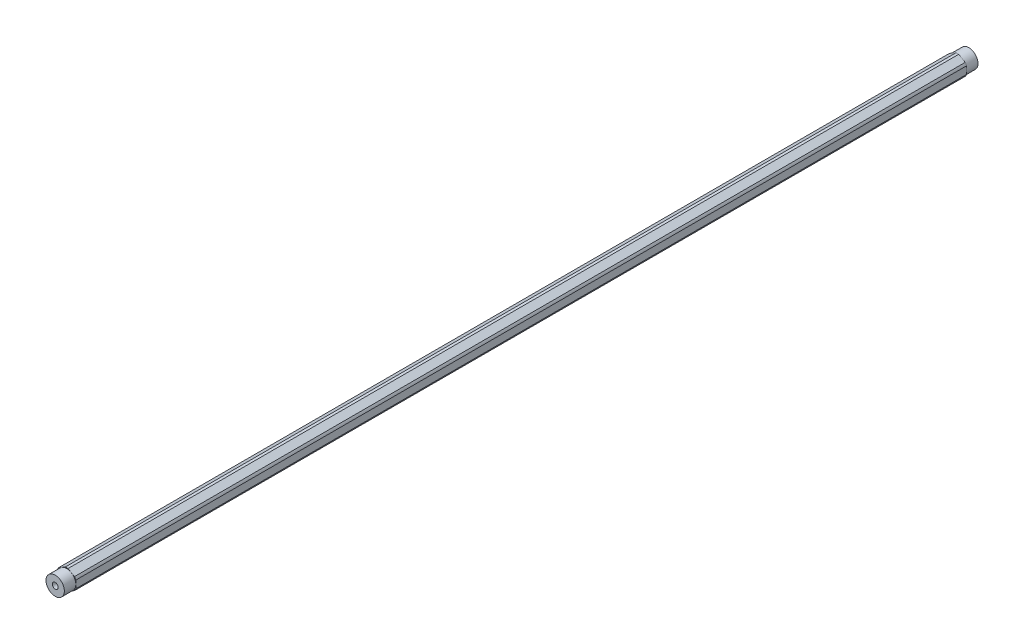
ISO-10303-21;
HEADER;
FILE_DESCRIPTION(('STEP AP214'),'2;1');
FILE_NAME('part.step','',(''),(''),'','','');
FILE_SCHEMA(('AUTOMOTIVE_DESIGN { 1 0 10303 214 1 1 1 1 }'));
ENDSEC;
DATA;
#1=APPLICATION_CONTEXT('core data for automotive mechanical design processes');
#2=APPLICATION_PROTOCOL_DEFINITION('international standard','automotive_design',2000,#1);
#3=PRODUCT_CONTEXT('',#1,'mechanical');
#4=PRODUCT('Part','Part','',(#3));
#5=PRODUCT_RELATED_PRODUCT_CATEGORY('part','',(#4));
#6=PRODUCT_DEFINITION_FORMATION('','',#4);
#7=PRODUCT_DEFINITION_CONTEXT('part definition',#1,'design');
#8=PRODUCT_DEFINITION('design','',#6,#7);
#9=PRODUCT_DEFINITION_SHAPE('','',#8);
#10=(LENGTH_UNIT() NAMED_UNIT(*) SI_UNIT(.MILLI.,.METRE.));
#11=(NAMED_UNIT(*) PLANE_ANGLE_UNIT() SI_UNIT($,.RADIAN.));
#12=(NAMED_UNIT(*) SI_UNIT($,.STERADIAN.) SOLID_ANGLE_UNIT());
#13=UNCERTAINTY_MEASURE_WITH_UNIT(LENGTH_MEASURE(1.E-05),#10,'distance_accuracy_value','');
#14=(GEOMETRIC_REPRESENTATION_CONTEXT(3) GLOBAL_UNCERTAINTY_ASSIGNED_CONTEXT((#13)) GLOBAL_UNIT_ASSIGNED_CONTEXT((#10,
#11,#12)) REPRESENTATION_CONTEXT('',''));
#15=CARTESIAN_POINT('',(0.,0.,0.));
#16=DIRECTION('',(0.,0.,1.));
#17=DIRECTION('',(1.,0.,0.));
#18=AXIS2_PLACEMENT_3D('',#15,#16,#17);
#19=CARTESIAN_POINT('',(0.,0.,307.975));
#20=DIRECTION('',(0.,0.,-1.));
#21=DIRECTION('',(-1.,0.,0.));
#22=AXIS2_PLACEMENT_3D('',#19,#20,#21);
#23=CYLINDRICAL_SURFACE('',#22,2.0193);
#24=CARTESIAN_POINT('',(0.,0.,-315.9125));
#25=DIRECTION('',(0.,0.,-1.));
#26=DIRECTION('',(-1.,0.,0.));
#27=AXIS2_PLACEMENT_3D('',#24,#25,#26);
#28=CIRCLE('',#27,2.01929999999999);
#29=CARTESIAN_POINT('',(-2.01929999999999,0.,-315.9125));
#30=VERTEX_POINT('',#29);
#31=EDGE_CURVE('E192',#30,#30,#28,.T.);
#32=ORIENTED_EDGE('',*,*,#31,.T.);
#33=EDGE_LOOP('',(#32));
#34=FACE_BOUND('',#33,.T.);
#35=CARTESIAN_POINT('',(0.,0.,315.9125));
#36=DIRECTION('',(0.,0.,1.));
#37=DIRECTION('',(1.,0.,0.));
#38=AXIS2_PLACEMENT_3D('',#35,#36,#37);
#39=CIRCLE('',#38,2.01929999999999);
#40=CARTESIAN_POINT('',(2.01929999999999,0.,315.9125));
#41=VERTEX_POINT('',#40);
#42=EDGE_CURVE('E396',#41,#41,#39,.T.);
#43=ORIENTED_EDGE('',*,*,#42,.T.);
#44=EDGE_LOOP('',(#43));
#45=FACE_BOUND('',#44,.T.);
#46=ADVANCED_FACE('F53',(#34,#45),#23,.F.);
#47=CARTESIAN_POINT('',(0.,0.,-307.975));
#48=DIRECTION('',(0.,0.,1.));
#49=DIRECTION('',(1.,0.,0.));
#50=AXIS2_PLACEMENT_3D('',#47,#48,#49);
#51=PLANE('',#50);
#52=DIRECTION('',(0.,1.,0.));
#53=VECTOR('',#52,1.);
#54=CARTESIAN_POINT('',(6.35,0.,-307.975));
#55=LINE('',#54,#53);
#56=CARTESIAN_POINT('',(6.35,0.,-307.975));
#57=VERTEX_POINT('',#56);
#58=CARTESIAN_POINT('',(6.35,2.59030191290514,-307.975));
#59=VERTEX_POINT('',#58);
#60=EDGE_CURVE('E189',#57,#59,#55,.T.);
#61=ORIENTED_EDGE('',*,*,#60,.F.);
#62=CARTESIAN_POINT('',(0.,0.,-307.975));
#63=DIRECTION('',(0.,0.,1.));
#64=DIRECTION('',(1.,0.,0.));
#65=AXIS2_PLACEMENT_3D('',#62,#63,#64);
#66=CIRCLE('',#65,6.35);
#67=CARTESIAN_POINT('',(3.175,5.49926131403119,-307.975));
#68=VERTEX_POINT('',#67);
#69=EDGE_CURVE('E63',#57,#68,#66,.T.);
#70=ORIENTED_EDGE('',*,*,#69,.T.);
#71=DIRECTION('',(-0.866025403784439,0.5,0.));
#72=VECTOR('',#71,1.);
#73=CARTESIAN_POINT('',(3.175,5.49926131403119,-307.975));
#74=LINE('',#73,#72);
#75=CARTESIAN_POINT('',(5.41826726004727,4.20411035757862,-307.975));
#76=VERTEX_POINT('',#75);
#77=EDGE_CURVE('E188',#76,#68,#74,.T.);
#78=ORIENTED_EDGE('',*,*,#77,.F.);
#79=CARTESIAN_POINT('',(0.,0.,-307.975));
#80=DIRECTION('',(0.,0.,1.));
#81=DIRECTION('',(1.,0.,0.));
#82=AXIS2_PLACEMENT_3D('',#79,#80,#81);
#83=CIRCLE('',#82,6.858);
#84=EDGE_CURVE('E201',#59,#76,#83,.T.);
#85=ORIENTED_EDGE('',*,*,#84,.F.);
#86=EDGE_LOOP('',(#61,#70,#78,#85));
#87=FACE_BOUND('',#86,.T.);
#88=ADVANCED_FACE('F185',(#87),#51,.F.);
#89=CARTESIAN_POINT('',(0.931732739952731,6.79441227048375,-307.975));
#90=VERTEX_POINT('',#89);
#91=EDGE_CURVE('E195',#68,#90,#74,.T.);
#92=ORIENTED_EDGE('',*,*,#91,.F.);
#93=CARTESIAN_POINT('',(-3.175,5.49926131403119,-307.975));
#94=VERTEX_POINT('',#93);
#95=EDGE_CURVE('E11',#68,#94,#66,.T.);
#96=ORIENTED_EDGE('',*,*,#95,.T.);
#97=DIRECTION('',(-0.866025403784439,-0.5,0.));
#98=VECTOR('',#97,1.);
#99=CARTESIAN_POINT('',(-3.175,5.49926131403119,-307.975));
#100=LINE('',#99,#98);
#101=CARTESIAN_POINT('',(-0.93173273995273,6.79441227048375,-307.975));
#102=VERTEX_POINT('',#101);
#103=EDGE_CURVE('E213',#102,#94,#100,.T.);
#104=ORIENTED_EDGE('',*,*,#103,.F.);
#105=EDGE_CURVE('E197',#90,#102,#83,.T.);
#106=ORIENTED_EDGE('',*,*,#105,.F.);
#107=EDGE_LOOP('',(#92,#96,#104,#106));
#108=FACE_BOUND('',#107,.T.);
#109=ADVANCED_FACE('F196',(#108),#51,.F.);
#110=CARTESIAN_POINT('',(-5.41826726004727,4.20411035757862,-307.975));
#111=VERTEX_POINT('',#110);
#112=EDGE_CURVE('E208',#94,#111,#100,.T.);
#113=ORIENTED_EDGE('',*,*,#112,.F.);
#114=CARTESIAN_POINT('',(-6.35,0.,-307.975));
#115=VERTEX_POINT('',#114);
#116=EDGE_CURVE('E61',#94,#115,#66,.T.);
#117=ORIENTED_EDGE('',*,*,#116,.T.);
#118=DIRECTION('',(0.,-1.,0.));
#119=VECTOR('',#118,1.);
#120=CARTESIAN_POINT('',(-6.35,0.,-307.975));
#121=LINE('',#120,#119);
#122=CARTESIAN_POINT('',(-6.35,2.59030191290514,-307.975));
#123=VERTEX_POINT('',#122);
#124=EDGE_CURVE('E216',#123,#115,#121,.T.);
#125=ORIENTED_EDGE('',*,*,#124,.F.);
#126=EDGE_CURVE('E210',#111,#123,#83,.T.);
#127=ORIENTED_EDGE('',*,*,#126,.F.);
#128=EDGE_LOOP('',(#113,#117,#125,#127));
#129=FACE_BOUND('',#128,.T.);
#130=ADVANCED_FACE('F472',(#129),#51,.F.);
#131=CARTESIAN_POINT('',(-6.35,-2.59030191290514,-307.975));
#132=VERTEX_POINT('',#131);
#133=EDGE_CURVE('E220',#115,#132,#121,.T.);
#134=ORIENTED_EDGE('',*,*,#133,.F.);
#135=CARTESIAN_POINT('',(-3.175,-5.49926131403119,-307.975));
#136=VERTEX_POINT('',#135);
#137=EDGE_CURVE('E353',#115,#136,#66,.T.);
#138=ORIENTED_EDGE('',*,*,#137,.T.);
#139=DIRECTION('',(0.866025403784439,-0.5,0.));
#140=VECTOR('',#139,1.);
#141=CARTESIAN_POINT('',(-3.175,-5.49926131403119,-307.975));
#142=LINE('',#141,#140);
#143=CARTESIAN_POINT('',(-5.41826726004727,-4.20411035757862,-307.975));
#144=VERTEX_POINT('',#143);
#145=EDGE_CURVE('E221',#144,#136,#142,.T.);
#146=ORIENTED_EDGE('',*,*,#145,.F.);
#147=EDGE_CURVE('E219',#132,#144,#83,.T.);
#148=ORIENTED_EDGE('',*,*,#147,.F.);
#149=EDGE_LOOP('',(#134,#138,#146,#148));
#150=FACE_BOUND('',#149,.T.);
#151=ADVANCED_FACE('F352',(#150),#51,.F.);
#152=CARTESIAN_POINT('',(-0.931732739952726,-6.79441227048375,-307.975));
#153=VERTEX_POINT('',#152);
#154=EDGE_CURVE('E225',#136,#153,#142,.T.);
#155=ORIENTED_EDGE('',*,*,#154,.F.);
#156=CARTESIAN_POINT('',(3.175,-5.49926131403119,-307.975));
#157=VERTEX_POINT('',#156);
#158=EDGE_CURVE('E282',#136,#157,#66,.T.);
#159=ORIENTED_EDGE('',*,*,#158,.T.);
#160=DIRECTION('',(0.866025403784439,0.5,0.));
#161=VECTOR('',#160,1.);
#162=CARTESIAN_POINT('',(3.175,-5.49926131403118,-307.975));
#163=LINE('',#162,#161);
#164=CARTESIAN_POINT('',(0.931732739952718,-6.79441227048375,-307.975));
#165=VERTEX_POINT('',#164);
#166=EDGE_CURVE('E226',#165,#157,#163,.T.);
#167=ORIENTED_EDGE('',*,*,#166,.F.);
#168=EDGE_CURVE('E224',#153,#165,#83,.T.);
#169=ORIENTED_EDGE('',*,*,#168,.F.);
#170=EDGE_LOOP('',(#155,#159,#167,#169));
#171=FACE_BOUND('',#170,.T.);
#172=ADVANCED_FACE('F373',(#171),#51,.F.);
#173=CARTESIAN_POINT('',(0.,0.,307.975));
#174=DIRECTION('',(0.,0.,1.));
#175=DIRECTION('',(1.,0.,0.));
#176=AXIS2_PLACEMENT_3D('',#173,#174,#175);
#177=PLANE('',#176);
#178=CARTESIAN_POINT('',(0.,0.,307.975));
#179=DIRECTION('',(0.,0.,1.));
#180=DIRECTION('',(1.,0.,0.));
#181=AXIS2_PLACEMENT_3D('',#178,#179,#180);
#182=CIRCLE('',#181,6.35);
#183=CARTESIAN_POINT('',(6.35,0.,307.975));
#184=VERTEX_POINT('',#183);
#185=CARTESIAN_POINT('',(3.175,5.49926131403119,307.975));
#186=VERTEX_POINT('',#185);
#187=EDGE_CURVE('E266',#184,#186,#182,.T.);
#188=ORIENTED_EDGE('',*,*,#187,.F.);
#189=DIRECTION('',(0.,1.,0.));
#190=VECTOR('',#189,1.);
#191=CARTESIAN_POINT('',(6.35,0.,307.975));
#192=LINE('',#191,#190);
#193=CARTESIAN_POINT('',(6.35,2.59030191290514,307.975));
#194=VERTEX_POINT('',#193);
#195=EDGE_CURVE('E333',#184,#194,#192,.T.);
#196=ORIENTED_EDGE('',*,*,#195,.T.);
#197=CARTESIAN_POINT('',(0.,0.,307.975));
#198=DIRECTION('',(0.,0.,1.));
#199=DIRECTION('',(1.,0.,0.));
#200=AXIS2_PLACEMENT_3D('',#197,#198,#199);
#201=CIRCLE('',#200,6.858);
#202=CARTESIAN_POINT('',(5.41826726004727,4.20411035757862,307.975));
#203=VERTEX_POINT('',#202);
#204=EDGE_CURVE('E324',#194,#203,#201,.T.);
#205=ORIENTED_EDGE('',*,*,#204,.T.);
#206=DIRECTION('',(-0.866025403784439,0.5,0.));
#207=VECTOR('',#206,1.);
#208=CARTESIAN_POINT('',(3.175,5.49926131403119,307.975));
#209=LINE('',#208,#207);
#210=EDGE_CURVE('E327',#203,#186,#209,.T.);
#211=ORIENTED_EDGE('',*,*,#210,.T.);
#212=EDGE_LOOP('',(#188,#196,#205,#211));
#213=FACE_BOUND('',#212,.T.);
#214=ADVANCED_FACE('F370',(#213),#177,.T.);
#215=CARTESIAN_POINT('',(-3.175,5.49926131403119,307.975));
#216=VERTEX_POINT('',#215);
#217=EDGE_CURVE('E274',#186,#216,#182,.T.);
#218=ORIENTED_EDGE('',*,*,#217,.F.);
#219=CARTESIAN_POINT('',(0.931732739952731,6.79441227048375,307.975));
#220=VERTEX_POINT('',#219);
#221=EDGE_CURVE('E328',#186,#220,#209,.T.);
#222=ORIENTED_EDGE('',*,*,#221,.T.);
#223=CARTESIAN_POINT('',(-0.93173273995273,6.79441227048375,307.975));
#224=VERTEX_POINT('',#223);
#225=EDGE_CURVE('E330',#220,#224,#201,.T.);
#226=ORIENTED_EDGE('',*,*,#225,.T.);
#227=DIRECTION('',(-0.866025403784439,-0.5,0.));
#228=VECTOR('',#227,1.);
#229=CARTESIAN_POINT('',(-3.175,5.49926131403119,307.975));
#230=LINE('',#229,#228);
#231=EDGE_CURVE('E312',#224,#216,#230,.T.);
#232=ORIENTED_EDGE('',*,*,#231,.T.);
#233=EDGE_LOOP('',(#218,#222,#226,#232));
#234=FACE_BOUND('',#233,.T.);
#235=ADVANCED_FACE('F372',(#234),#177,.T.);
#236=CARTESIAN_POINT('',(-6.35,0.,307.975));
#237=VERTEX_POINT('',#236);
#238=EDGE_CURVE('E280',#216,#237,#182,.T.);
#239=ORIENTED_EDGE('',*,*,#238,.F.);
#240=CARTESIAN_POINT('',(-5.41826726004727,4.20411035757862,307.975));
#241=VERTEX_POINT('',#240);
#242=EDGE_CURVE('E331',#216,#241,#230,.T.);
#243=ORIENTED_EDGE('',*,*,#242,.T.);
#244=CARTESIAN_POINT('',(-6.35,2.59030191290514,307.975));
#245=VERTEX_POINT('',#244);
#246=EDGE_CURVE('E299',#241,#245,#201,.T.);
#247=ORIENTED_EDGE('',*,*,#246,.T.);
#248=DIRECTION('',(0.,-1.,0.));
#249=VECTOR('',#248,1.);
#250=CARTESIAN_POINT('',(-6.35,0.,307.975));
#251=LINE('',#250,#249);
#252=EDGE_CURVE('E297',#245,#237,#251,.T.);
#253=ORIENTED_EDGE('',*,*,#252,.T.);
#254=EDGE_LOOP('',(#239,#243,#247,#253));
#255=FACE_BOUND('',#254,.T.);
#256=ADVANCED_FACE('F302',(#255),#177,.T.);
#257=CARTESIAN_POINT('',(-3.175,-5.49926131403119,307.975));
#258=VERTEX_POINT('',#257);
#259=EDGE_CURVE('E270',#237,#258,#182,.T.);
#260=ORIENTED_EDGE('',*,*,#259,.F.);
#261=CARTESIAN_POINT('',(-6.35,-2.59030191290514,307.975));
#262=VERTEX_POINT('',#261);
#263=EDGE_CURVE('E289',#237,#262,#251,.T.);
#264=ORIENTED_EDGE('',*,*,#263,.T.);
#265=CARTESIAN_POINT('',(-5.41826726004727,-4.20411035757862,307.975));
#266=VERTEX_POINT('',#265);
#267=EDGE_CURVE('E306',#262,#266,#201,.T.);
#268=ORIENTED_EDGE('',*,*,#267,.T.);
#269=DIRECTION('',(0.866025403784439,-0.5,0.));
#270=VECTOR('',#269,1.);
#271=CARTESIAN_POINT('',(-3.175,-5.49926131403119,307.975));
#272=LINE('',#271,#270);
#273=EDGE_CURVE('E292',#266,#258,#272,.T.);
#274=ORIENTED_EDGE('',*,*,#273,.T.);
#275=EDGE_LOOP('',(#260,#264,#268,#274));
#276=FACE_BOUND('',#275,.T.);
#277=ADVANCED_FACE('F288',(#276),#177,.T.);
#278=CARTESIAN_POINT('',(3.175,-5.49926131403118,307.975));
#279=VERTEX_POINT('',#278);
#280=EDGE_CURVE('E264',#258,#279,#182,.T.);
#281=ORIENTED_EDGE('',*,*,#280,.F.);
#282=CARTESIAN_POINT('',(-0.931732739952726,-6.79441227048375,307.975));
#283=VERTEX_POINT('',#282);
#284=EDGE_CURVE('E307',#258,#283,#272,.T.);
#285=ORIENTED_EDGE('',*,*,#284,.T.);
#286=CARTESIAN_POINT('',(0.931732739952718,-6.79441227048375,307.975));
#287=VERTEX_POINT('',#286);
#288=EDGE_CURVE('E309',#283,#287,#201,.T.);
#289=ORIENTED_EDGE('',*,*,#288,.T.);
#290=DIRECTION('',(0.866025403784439,0.5,0.));
#291=VECTOR('',#290,1.);
#292=CARTESIAN_POINT('',(3.175,-5.49926131403118,307.975));
#293=LINE('',#292,#291);
#294=EDGE_CURVE('E315',#287,#279,#293,.T.);
#295=ORIENTED_EDGE('',*,*,#294,.T.);
#296=EDGE_LOOP('',(#281,#285,#289,#295));
#297=FACE_BOUND('',#296,.T.);
#298=ADVANCED_FACE('F361',(#297),#177,.T.);
#299=CARTESIAN_POINT('',(6.35,0.,307.975));
#300=DIRECTION('',(-1.,0.,0.));
#301=DIRECTION('',(0.,0.,1.));
#302=AXIS2_PLACEMENT_3D('',#299,#300,#301);
#303=PLANE('',#302);
#304=CARTESIAN_POINT('',(6.35,-2.59030191290514,-307.975));
#305=VERTEX_POINT('',#304);
#306=EDGE_CURVE('E318',#305,#57,#55,.T.);
#307=ORIENTED_EDGE('',*,*,#306,.T.);
#308=ORIENTED_EDGE('',*,*,#60,.T.);
#309=DIRECTION('',(0.,0.,-1.));
#310=VECTOR('',#309,1.);
#311=CARTESIAN_POINT('',(6.35,2.59030191290514,307.975));
#312=LINE('',#311,#310);
#313=EDGE_CURVE('E56',#194,#59,#312,.T.);
#314=ORIENTED_EDGE('',*,*,#313,.F.);
#315=ORIENTED_EDGE('',*,*,#195,.F.);
#316=CARTESIAN_POINT('',(6.35,-2.59030191290514,307.975));
#317=VERTEX_POINT('',#316);
#318=EDGE_CURVE('E332',#317,#184,#192,.T.);
#319=ORIENTED_EDGE('',*,*,#318,.F.);
#320=DIRECTION('',(0.,0.,-1.));
#321=VECTOR('',#320,1.);
#322=CARTESIAN_POINT('',(6.35,-2.59030191290514,307.975));
#323=LINE('',#322,#321);
#324=EDGE_CURVE('E231',#317,#305,#323,.T.);
#325=ORIENTED_EDGE('',*,*,#324,.T.);
#326=EDGE_LOOP('',(#307,#308,#314,#315,#319,#325));
#327=FACE_BOUND('',#326,.T.);
#328=ADVANCED_FACE('F321',(#327),#303,.F.);
#329=CARTESIAN_POINT('',(0.,0.,307.975));
#330=DIRECTION('',(0.,0.,-1.));
#331=DIRECTION('',(-1.,0.,0.));
#332=AXIS2_PLACEMENT_3D('',#329,#330,#331);
#333=CYLINDRICAL_SURFACE('',#332,6.858);
#334=ORIENTED_EDGE('',*,*,#84,.T.);
#335=DIRECTION('',(0.,0.,-1.));
#336=VECTOR('',#335,1.);
#337=CARTESIAN_POINT('',(5.41826726004727,4.20411035757862,307.975));
#338=LINE('',#337,#336);
#339=EDGE_CURVE('E207',#203,#76,#338,.T.);
#340=ORIENTED_EDGE('',*,*,#339,.F.);
#341=ORIENTED_EDGE('',*,*,#204,.F.);
#342=ORIENTED_EDGE('',*,*,#313,.T.);
#343=EDGE_LOOP('',(#334,#340,#341,#342));
#344=FACE_BOUND('',#343,.T.);
#345=ADVANCED_FACE('F323',(#344),#333,.T.);
#346=CARTESIAN_POINT('',(3.175,5.49926131403119,307.975));
#347=DIRECTION('',(-0.5,-0.866025403784439,0.));
#348=DIRECTION('',(0.866025403784439,-0.5,0.));
#349=AXIS2_PLACEMENT_3D('',#346,#347,#348);
#350=PLANE('',#349);
#351=ORIENTED_EDGE('',*,*,#77,.T.);
#352=ORIENTED_EDGE('',*,*,#91,.T.);
#353=DIRECTION('',(0.,0.,-1.));
#354=VECTOR('',#353,1.);
#355=CARTESIAN_POINT('',(0.931732739952731,6.79441227048375,307.975));
#356=LINE('',#355,#354);
#357=EDGE_CURVE('E259',#220,#90,#356,.T.);
#358=ORIENTED_EDGE('',*,*,#357,.F.);
#359=ORIENTED_EDGE('',*,*,#221,.F.);
#360=ORIENTED_EDGE('',*,*,#210,.F.);
#361=ORIENTED_EDGE('',*,*,#339,.T.);
#362=EDGE_LOOP('',(#351,#352,#358,#359,#360,#361));
#363=FACE_BOUND('',#362,.T.);
#364=ADVANCED_FACE('F204',(#363),#350,.F.);
#365=ORIENTED_EDGE('',*,*,#105,.T.);
#366=DIRECTION('',(0.,0.,-1.));
#367=VECTOR('',#366,1.);
#368=CARTESIAN_POINT('',(-0.93173273995273,6.79441227048375,307.975));
#369=LINE('',#368,#367);
#370=EDGE_CURVE('E256',#224,#102,#369,.T.);
#371=ORIENTED_EDGE('',*,*,#370,.F.);
#372=ORIENTED_EDGE('',*,*,#225,.F.);
#373=ORIENTED_EDGE('',*,*,#357,.T.);
#374=EDGE_LOOP('',(#365,#371,#372,#373));
#375=FACE_BOUND('',#374,.T.);
#376=ADVANCED_FACE('F600',(#375),#333,.T.);
#377=CARTESIAN_POINT('',(-3.175,5.49926131403119,307.975));
#378=DIRECTION('',(0.5,-0.866025403784439,0.));
#379=DIRECTION('',(0.866025403784439,0.5,0.));
#380=AXIS2_PLACEMENT_3D('',#377,#378,#379);
#381=PLANE('',#380);
#382=ORIENTED_EDGE('',*,*,#103,.T.);
#383=ORIENTED_EDGE('',*,*,#112,.T.);
#384=DIRECTION('',(0.,0.,-1.));
#385=VECTOR('',#384,1.);
#386=CARTESIAN_POINT('',(-5.41826726004727,4.20411035757862,307.975));
#387=LINE('',#386,#385);
#388=EDGE_CURVE('E253',#241,#111,#387,.T.);
#389=ORIENTED_EDGE('',*,*,#388,.F.);
#390=ORIENTED_EDGE('',*,*,#242,.F.);
#391=ORIENTED_EDGE('',*,*,#231,.F.);
#392=ORIENTED_EDGE('',*,*,#370,.T.);
#393=EDGE_LOOP('',(#382,#383,#389,#390,#391,#392));
#394=FACE_BOUND('',#393,.T.);
#395=ADVANCED_FACE('F599',(#394),#381,.F.);
#396=ORIENTED_EDGE('',*,*,#126,.T.);
#397=DIRECTION('',(0.,0.,-1.));
#398=VECTOR('',#397,1.);
#399=CARTESIAN_POINT('',(-6.35,2.59030191290514,307.975));
#400=LINE('',#399,#398);
#401=EDGE_CURVE('E250',#245,#123,#400,.T.);
#402=ORIENTED_EDGE('',*,*,#401,.F.);
#403=ORIENTED_EDGE('',*,*,#246,.F.);
#404=ORIENTED_EDGE('',*,*,#388,.T.);
#405=EDGE_LOOP('',(#396,#402,#403,#404));
#406=FACE_BOUND('',#405,.T.);
#407=ADVANCED_FACE('F585',(#406),#333,.T.);
#408=CARTESIAN_POINT('',(-6.35,0.,307.975));
#409=DIRECTION('',(1.,0.,0.));
#410=DIRECTION('',(0.,1.,0.));
#411=AXIS2_PLACEMENT_3D('',#408,#409,#410);
#412=PLANE('',#411);
#413=ORIENTED_EDGE('',*,*,#124,.T.);
#414=ORIENTED_EDGE('',*,*,#133,.T.);
#415=DIRECTION('',(0.,0.,-1.));
#416=VECTOR('',#415,1.);
#417=CARTESIAN_POINT('',(-6.35,-2.59030191290514,307.975));
#418=LINE('',#417,#416);
#419=EDGE_CURVE('E247',#262,#132,#418,.T.);
#420=ORIENTED_EDGE('',*,*,#419,.F.);
#421=ORIENTED_EDGE('',*,*,#263,.F.);
#422=ORIENTED_EDGE('',*,*,#252,.F.);
#423=ORIENTED_EDGE('',*,*,#401,.T.);
#424=EDGE_LOOP('',(#413,#414,#420,#421,#422,#423));
#425=FACE_BOUND('',#424,.T.);
#426=ADVANCED_FACE('F296',(#425),#412,.F.);
#427=ORIENTED_EDGE('',*,*,#147,.T.);
#428=DIRECTION('',(0.,0.,-1.));
#429=VECTOR('',#428,1.);
#430=CARTESIAN_POINT('',(-5.41826726004727,-4.20411035757862,307.975));
#431=LINE('',#430,#429);
#432=EDGE_CURVE('E244',#266,#144,#431,.T.);
#433=ORIENTED_EDGE('',*,*,#432,.F.);
#434=ORIENTED_EDGE('',*,*,#267,.F.);
#435=ORIENTED_EDGE('',*,*,#419,.T.);
#436=EDGE_LOOP('',(#427,#433,#434,#435));
#437=FACE_BOUND('',#436,.T.);
#438=ADVANCED_FACE('F350',(#437),#333,.T.);
#439=CARTESIAN_POINT('',(-3.175,-5.49926131403119,307.975));
#440=DIRECTION('',(0.5,0.866025403784439,0.));
#441=DIRECTION('',(-0.866025403784439,0.5,0.));
#442=AXIS2_PLACEMENT_3D('',#439,#440,#441);
#443=PLANE('',#442);
#444=ORIENTED_EDGE('',*,*,#145,.T.);
#445=ORIENTED_EDGE('',*,*,#154,.T.);
#446=DIRECTION('',(0.,0.,-1.));
#447=VECTOR('',#446,1.);
#448=CARTESIAN_POINT('',(-0.931732739952726,-6.79441227048375,307.975));
#449=LINE('',#448,#447);
#450=EDGE_CURVE('E241',#283,#153,#449,.T.);
#451=ORIENTED_EDGE('',*,*,#450,.F.);
#452=ORIENTED_EDGE('',*,*,#284,.F.);
#453=ORIENTED_EDGE('',*,*,#273,.F.);
#454=ORIENTED_EDGE('',*,*,#432,.T.);
#455=EDGE_LOOP('',(#444,#445,#451,#452,#453,#454));
#456=FACE_BOUND('',#455,.T.);
#457=ADVANCED_FACE('F356',(#456),#443,.F.);
#458=ORIENTED_EDGE('',*,*,#168,.T.);
#459=DIRECTION('',(0.,0.,-1.));
#460=VECTOR('',#459,1.);
#461=CARTESIAN_POINT('',(0.931732739952718,-6.79441227048375,307.975));
#462=LINE('',#461,#460);
#463=EDGE_CURVE('E238',#287,#165,#462,.T.);
#464=ORIENTED_EDGE('',*,*,#463,.F.);
#465=ORIENTED_EDGE('',*,*,#288,.F.);
#466=ORIENTED_EDGE('',*,*,#450,.T.);
#467=EDGE_LOOP('',(#458,#464,#465,#466));
#468=FACE_BOUND('',#467,.T.);
#469=ADVANCED_FACE('F553',(#468),#333,.T.);
#470=CARTESIAN_POINT('',(3.175,-5.49926131403118,307.975));
#471=DIRECTION('',(-0.5,0.866025403784439,0.));
#472=DIRECTION('',(-0.866025403784439,-0.5,0.));
#473=AXIS2_PLACEMENT_3D('',#470,#471,#472);
#474=PLANE('',#473);
#475=ORIENTED_EDGE('',*,*,#166,.T.);
#476=CARTESIAN_POINT('',(5.41826726004728,-4.20411035757861,-307.975));
#477=VERTEX_POINT('',#476);
#478=EDGE_CURVE('E230',#157,#477,#163,.T.);
#479=ORIENTED_EDGE('',*,*,#478,.T.);
#480=DIRECTION('',(0.,0.,-1.));
#481=VECTOR('',#480,1.);
#482=CARTESIAN_POINT('',(5.41826726004728,-4.20411035757861,307.975));
#483=LINE('',#482,#481);
#484=CARTESIAN_POINT('',(5.41826726004728,-4.20411035757861,307.975));
#485=VERTEX_POINT('',#484);
#486=EDGE_CURVE('E234',#485,#477,#483,.T.);
#487=ORIENTED_EDGE('',*,*,#486,.F.);
#488=EDGE_CURVE('E317',#279,#485,#293,.T.);
#489=ORIENTED_EDGE('',*,*,#488,.F.);
#490=ORIENTED_EDGE('',*,*,#294,.F.);
#491=ORIENTED_EDGE('',*,*,#463,.T.);
#492=EDGE_LOOP('',(#475,#479,#487,#489,#490,#491));
#493=FACE_BOUND('',#492,.T.);
#494=ADVANCED_FACE('F364',(#493),#474,.F.);
#495=EDGE_CURVE('E229',#477,#305,#83,.T.);
#496=ORIENTED_EDGE('',*,*,#495,.T.);
#497=ORIENTED_EDGE('',*,*,#324,.F.);
#498=EDGE_CURVE('E235',#485,#317,#201,.T.);
#499=ORIENTED_EDGE('',*,*,#498,.F.);
#500=ORIENTED_EDGE('',*,*,#486,.T.);
#501=EDGE_LOOP('',(#496,#497,#499,#500));
#502=FACE_BOUND('',#501,.T.);
#503=ADVANCED_FACE('F369',(#502),#333,.T.);
#504=EDGE_CURVE('E77',#279,#184,#182,.T.);
#505=ORIENTED_EDGE('',*,*,#504,.F.);
#506=ORIENTED_EDGE('',*,*,#488,.T.);
#507=ORIENTED_EDGE('',*,*,#498,.T.);
#508=ORIENTED_EDGE('',*,*,#318,.T.);
#509=EDGE_LOOP('',(#505,#506,#507,#508));
#510=FACE_BOUND('',#509,.T.);
#511=ADVANCED_FACE('F368',(#510),#177,.T.);
#512=ORIENTED_EDGE('',*,*,#478,.F.);
#513=EDGE_CURVE('E193',#157,#57,#66,.T.);
#514=ORIENTED_EDGE('',*,*,#513,.T.);
#515=ORIENTED_EDGE('',*,*,#306,.F.);
#516=ORIENTED_EDGE('',*,*,#495,.F.);
#517=EDGE_LOOP('',(#512,#514,#515,#516));
#518=FACE_BOUND('',#517,.T.);
#519=ADVANCED_FACE('F383',(#518),#51,.F.);
#520=CARTESIAN_POINT('',(0.,0.,315.9125));
#521=DIRECTION('',(0.,0.,1.));
#522=DIRECTION('',(1.,0.,0.));
#523=AXIS2_PLACEMENT_3D('',#520,#521,#522);
#524=PLANE('',#523);
#525=ORIENTED_EDGE('',*,*,#42,.F.);
#526=EDGE_LOOP('',(#525));
#527=FACE_BOUND('',#526,.T.);
#528=CARTESIAN_POINT('',(0.,0.,315.9125));
#529=DIRECTION('',(0.,0.,1.));
#530=DIRECTION('',(1.,0.,0.));
#531=AXIS2_PLACEMENT_3D('',#528,#529,#530);
#532=CIRCLE('',#531,6.35);
#533=CARTESIAN_POINT('',(6.35,0.,315.9125));
#534=VERTEX_POINT('',#533);
#535=EDGE_CURVE('E273',#534,#534,#532,.T.);
#536=ORIENTED_EDGE('',*,*,#535,.T.);
#537=EDGE_LOOP('',(#536));
#538=FACE_BOUND('',#537,.T.);
#539=ADVANCED_FACE('F400',(#527,#538),#524,.T.);
#540=CARTESIAN_POINT('',(0.,0.,315.9125));
#541=DIRECTION('',(0.,0.,-1.));
#542=DIRECTION('',(-1.,0.,0.));
#543=AXIS2_PLACEMENT_3D('',#540,#541,#542);
#544=CYLINDRICAL_SURFACE('',#543,6.35);
#545=ORIENTED_EDGE('',*,*,#535,.F.);
#546=EDGE_LOOP('',(#545));
#547=FACE_BOUND('',#546,.T.);
#548=ORIENTED_EDGE('',*,*,#187,.T.);
#549=ORIENTED_EDGE('',*,*,#217,.T.);
#550=ORIENTED_EDGE('',*,*,#238,.T.);
#551=ORIENTED_EDGE('',*,*,#259,.T.);
#552=ORIENTED_EDGE('',*,*,#280,.T.);
#553=ORIENTED_EDGE('',*,*,#504,.T.);
#554=EDGE_LOOP('',(#548,#549,#550,#551,#552,#553));
#555=FACE_BOUND('',#554,.T.);
#556=ADVANCED_FACE('F284',(#547,#555),#544,.T.);
#557=CARTESIAN_POINT('',(0.,0.,-315.9125));
#558=DIRECTION('',(0.,0.,-1.));
#559=DIRECTION('',(1.,0.,0.));
#560=AXIS2_PLACEMENT_3D('',#557,#558,#559);
#561=PLANE('',#560);
#562=ORIENTED_EDGE('',*,*,#31,.F.);
#563=EDGE_LOOP('',(#562));
#564=FACE_BOUND('',#563,.T.);
#565=CARTESIAN_POINT('',(0.,0.,-315.9125));
#566=DIRECTION('',(0.,0.,1.));
#567=DIRECTION('',(1.,0.,0.));
#568=AXIS2_PLACEMENT_3D('',#565,#566,#567);
#569=CIRCLE('',#568,6.35);
#570=CARTESIAN_POINT('',(6.35,0.,-315.9125));
#571=VERTEX_POINT('',#570);
#572=EDGE_CURVE('E191',#571,#571,#569,.T.);
#573=ORIENTED_EDGE('',*,*,#572,.F.);
#574=EDGE_LOOP('',(#573));
#575=FACE_BOUND('',#574,.T.);
#576=ADVANCED_FACE('F407',(#564,#575),#561,.T.);
#577=CARTESIAN_POINT('',(0.,0.,-315.9125));
#578=DIRECTION('',(0.,0.,1.));
#579=DIRECTION('',(1.,0.,0.));
#580=AXIS2_PLACEMENT_3D('',#577,#578,#579);
#581=CYLINDRICAL_SURFACE('',#580,6.35);
#582=ORIENTED_EDGE('',*,*,#572,.T.);
#583=EDGE_LOOP('',(#582));
#584=FACE_BOUND('',#583,.T.);
#585=ORIENTED_EDGE('',*,*,#69,.F.);
#586=ORIENTED_EDGE('',*,*,#513,.F.);
#587=ORIENTED_EDGE('',*,*,#158,.F.);
#588=ORIENTED_EDGE('',*,*,#137,.F.);
#589=ORIENTED_EDGE('',*,*,#116,.F.);
#590=ORIENTED_EDGE('',*,*,#95,.F.);
#591=EDGE_LOOP('',(#585,#586,#587,#588,#589,#590));
#592=FACE_BOUND('',#591,.T.);
#593=ADVANCED_FACE('F176',(#584,#592),#581,.T.);
#594=CLOSED_SHELL('',(#46,#88,#109,#130,#151,#172,#214,#235,#256,#277,#298,#328,#345,#364,#376,
#395,#407,#426,#438,#457,#469,#494,#503,#511,#519,#539,#556,#576,#593));
#595=MANIFOLD_SOLID_BREP('B2',#594);
#596=ADVANCED_BREP_SHAPE_REPRESENTATION('',(#18,#595),#14);
#597=SHAPE_DEFINITION_REPRESENTATION(#9,#596);
ENDSEC;
END-ISO-10303-21;
